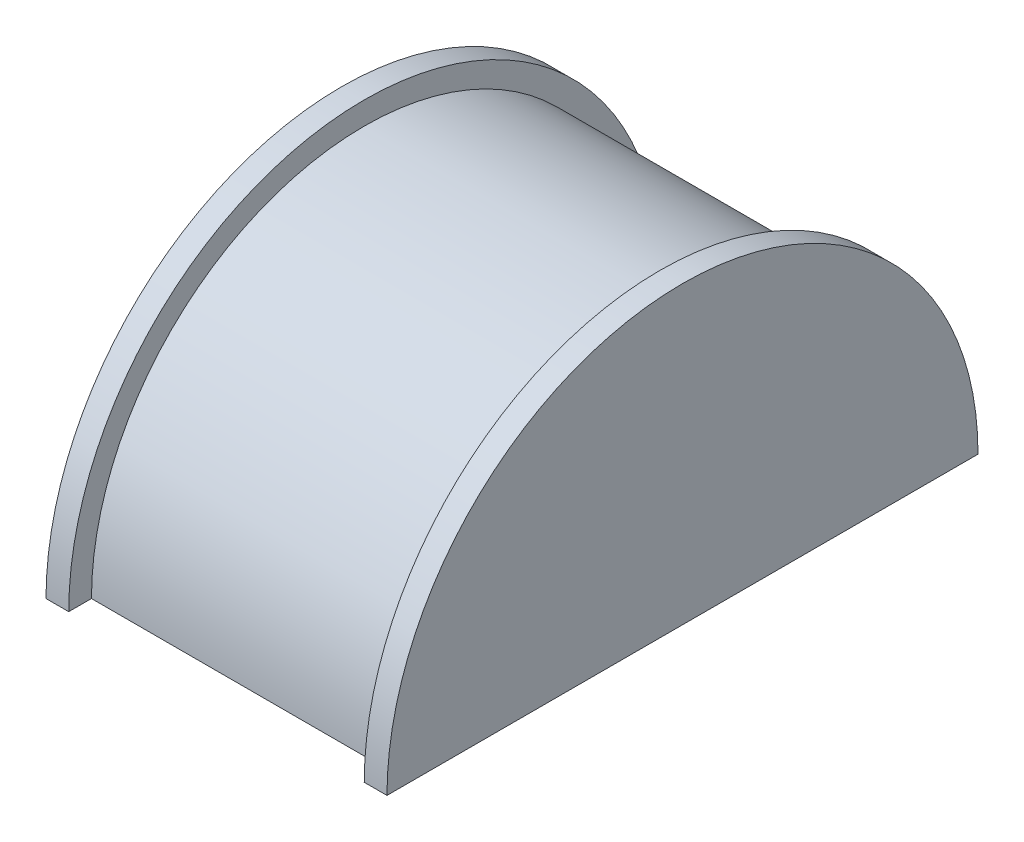
ISO-10303-21;
HEADER;
FILE_DESCRIPTION(('STEP AP214'),'2;1');
FILE_NAME('part.step','',(''),(''),'','','');
FILE_SCHEMA(('AUTOMOTIVE_DESIGN { 1 0 10303 214 1 1 1 1 }'));
ENDSEC;
DATA;
#1=APPLICATION_CONTEXT('core data for automotive mechanical design processes');
#2=APPLICATION_PROTOCOL_DEFINITION('international standard','automotive_design',2000,#1);
#3=PRODUCT_CONTEXT('',#1,'mechanical');
#4=PRODUCT('Part','Part','',(#3));
#5=PRODUCT_RELATED_PRODUCT_CATEGORY('part','',(#4));
#6=PRODUCT_DEFINITION_FORMATION('','',#4);
#7=PRODUCT_DEFINITION_CONTEXT('part definition',#1,'design');
#8=PRODUCT_DEFINITION('design','',#6,#7);
#9=PRODUCT_DEFINITION_SHAPE('','',#8);
#10=(LENGTH_UNIT() NAMED_UNIT(*) SI_UNIT(.MILLI.,.METRE.));
#11=(NAMED_UNIT(*) PLANE_ANGLE_UNIT() SI_UNIT($,.RADIAN.));
#12=(NAMED_UNIT(*) SI_UNIT($,.STERADIAN.) SOLID_ANGLE_UNIT());
#13=UNCERTAINTY_MEASURE_WITH_UNIT(LENGTH_MEASURE(1.E-05),#10,'distance_accuracy_value','');
#14=(GEOMETRIC_REPRESENTATION_CONTEXT(3) GLOBAL_UNCERTAINTY_ASSIGNED_CONTEXT((#13)) GLOBAL_UNIT_ASSIGNED_CONTEXT((#10,
#11,#12)) REPRESENTATION_CONTEXT('',''));
#15=CARTESIAN_POINT('',(0.,0.,0.));
#16=DIRECTION('',(0.,0.,1.));
#17=DIRECTION('',(1.,0.,0.));
#18=AXIS2_PLACEMENT_3D('',#15,#16,#17);
#19=CARTESIAN_POINT('',(6.5,0.,0.));
#20=DIRECTION('',(-1.,0.,0.));
#21=DIRECTION('',(0.,0.,1.));
#22=AXIS2_PLACEMENT_3D('',#19,#20,#21);
#23=CYLINDRICAL_SURFACE('',#22,6.);
#24=CARTESIAN_POINT('',(0.,0.,0.));
#25=DIRECTION('',(1.,0.,0.));
#26=DIRECTION('',(0.,0.,-1.));
#27=AXIS2_PLACEMENT_3D('',#24,#25,#26);
#28=CIRCLE('',#27,6.);
#29=CARTESIAN_POINT('',(0.,0.,-6.));
#30=VERTEX_POINT('',#29);
#31=CARTESIAN_POINT('',(0.,0.,6.));
#32=VERTEX_POINT('',#31);
#33=EDGE_CURVE('E125',#30,#32,#28,.T.);
#34=ORIENTED_EDGE('',*,*,#33,.T.);
#35=DIRECTION('',(-1.,0.,0.));
#36=VECTOR('',#35,1.);
#37=CARTESIAN_POINT('',(6.5,0.,6.));
#38=LINE('',#37,#36);
#39=CARTESIAN_POINT('',(6.5,0.,6.));
#40=VERTEX_POINT('',#39);
#41=EDGE_CURVE('E11',#40,#32,#38,.T.);
#42=ORIENTED_EDGE('',*,*,#41,.F.);
#43=CARTESIAN_POINT('',(6.5,0.,0.));
#44=DIRECTION('',(1.,0.,0.));
#45=DIRECTION('',(0.,0.,-1.));
#46=AXIS2_PLACEMENT_3D('',#43,#44,#45);
#47=CIRCLE('',#46,6.);
#48=CARTESIAN_POINT('',(6.5,0.,-6.));
#49=VERTEX_POINT('',#48);
#50=EDGE_CURVE('E126',#49,#40,#47,.T.);
#51=ORIENTED_EDGE('',*,*,#50,.F.);
#52=DIRECTION('',(-1.,0.,0.));
#53=VECTOR('',#52,1.);
#54=CARTESIAN_POINT('',(6.5,0.,-6.));
#55=LINE('',#54,#53);
#56=EDGE_CURVE('E41',#49,#30,#55,.T.);
#57=ORIENTED_EDGE('',*,*,#56,.T.);
#58=EDGE_LOOP('',(#34,#42,#51,#57));
#59=FACE_BOUND('',#58,.T.);
#60=ADVANCED_FACE('F33',(#59),#23,.T.);
#61=CARTESIAN_POINT('',(6.5,0.,6.));
#62=DIRECTION('',(0.,1.,0.));
#63=DIRECTION('',(0.,0.,1.));
#64=AXIS2_PLACEMENT_3D('',#61,#62,#63);
#65=PLANE('',#64);
#66=CARTESIAN_POINT('',(3.25,0.,0.));
#67=DIRECTION('',(0.,-1.,0.));
#68=DIRECTION('',(0.,0.,-1.));
#69=AXIS2_PLACEMENT_3D('',#66,#67,#68);
#70=CIRCLE('',#69,1.9);
#71=CARTESIAN_POINT('',(3.25,0.,-1.9));
#72=VERTEX_POINT('',#71);
#73=EDGE_CURVE('E210',#72,#72,#70,.T.);
#74=ORIENTED_EDGE('',*,*,#73,.F.);
#75=EDGE_LOOP('',(#74));
#76=FACE_BOUND('',#75,.T.);
#77=ORIENTED_EDGE('',*,*,#41,.T.);
#78=DIRECTION('',(0.,0.,-1.));
#79=VECTOR('',#78,1.);
#80=CARTESIAN_POINT('',(0.,0.,6.5));
#81=LINE('',#80,#79);
#82=CARTESIAN_POINT('',(0.,0.,6.5));
#83=VERTEX_POINT('',#82);
#84=EDGE_CURVE('E96',#83,#32,#81,.T.);
#85=ORIENTED_EDGE('',*,*,#84,.F.);
#86=DIRECTION('',(1.,0.,0.));
#87=VECTOR('',#86,1.);
#88=CARTESIAN_POINT('',(-0.5,0.,6.5));
#89=LINE('',#88,#87);
#90=CARTESIAN_POINT('',(-0.5,0.,6.5));
#91=VERTEX_POINT('',#90);
#92=EDGE_CURVE('E91',#91,#83,#89,.T.);
#93=ORIENTED_EDGE('',*,*,#92,.F.);
#94=DIRECTION('',(0.,0.,-1.));
#95=VECTOR('',#94,1.);
#96=CARTESIAN_POINT('',(-0.5,0.,6.5));
#97=LINE('',#96,#95);
#98=CARTESIAN_POINT('',(-0.5,0.,-6.5));
#99=VERTEX_POINT('',#98);
#100=EDGE_CURVE('E95',#91,#99,#97,.T.);
#101=ORIENTED_EDGE('',*,*,#100,.T.);
#102=DIRECTION('',(1.,0.,0.));
#103=VECTOR('',#102,1.);
#104=CARTESIAN_POINT('',(-0.5,0.,-6.5));
#105=LINE('',#104,#103);
#106=CARTESIAN_POINT('',(0.,0.,-6.5));
#107=VERTEX_POINT('',#106);
#108=EDGE_CURVE('E82',#99,#107,#105,.T.);
#109=ORIENTED_EDGE('',*,*,#108,.T.);
#110=EDGE_CURVE('E105',#30,#107,#81,.T.);
#111=ORIENTED_EDGE('',*,*,#110,.F.);
#112=ORIENTED_EDGE('',*,*,#56,.F.);
#113=DIRECTION('',(0.,0.,-1.));
#114=VECTOR('',#113,1.);
#115=CARTESIAN_POINT('',(6.5,0.,6.5));
#116=LINE('',#115,#114);
#117=CARTESIAN_POINT('',(6.5,0.,-6.5));
#118=VERTEX_POINT('',#117);
#119=EDGE_CURVE('E117',#49,#118,#116,.T.);
#120=ORIENTED_EDGE('',*,*,#119,.T.);
#121=DIRECTION('',(-1.,0.,0.));
#122=VECTOR('',#121,1.);
#123=CARTESIAN_POINT('',(7.,0.,-6.5));
#124=LINE('',#123,#122);
#125=CARTESIAN_POINT('',(7.,0.,-6.5));
#126=VERTEX_POINT('',#125);
#127=EDGE_CURVE('E114',#126,#118,#124,.T.);
#128=ORIENTED_EDGE('',*,*,#127,.F.);
#129=DIRECTION('',(0.,0.,-1.));
#130=VECTOR('',#129,1.);
#131=CARTESIAN_POINT('',(7.,0.,6.5));
#132=LINE('',#131,#130);
#133=CARTESIAN_POINT('',(7.,0.,6.5));
#134=VERTEX_POINT('',#133);
#135=EDGE_CURVE('E111',#134,#126,#132,.T.);
#136=ORIENTED_EDGE('',*,*,#135,.F.);
#137=DIRECTION('',(-1.,0.,0.));
#138=VECTOR('',#137,1.);
#139=CARTESIAN_POINT('',(7.,0.,6.5));
#140=LINE('',#139,#138);
#141=CARTESIAN_POINT('',(6.5,0.,6.5));
#142=VERTEX_POINT('',#141);
#143=EDGE_CURVE('E122',#134,#142,#140,.T.);
#144=ORIENTED_EDGE('',*,*,#143,.T.);
#145=EDGE_CURVE('E112',#142,#40,#116,.T.);
#146=ORIENTED_EDGE('',*,*,#145,.T.);
#147=EDGE_LOOP('',(#77,#85,#93,#101,#109,#111,#112,#120,#128,#136,#144,#146));
#148=FACE_BOUND('',#147,.T.);
#149=ADVANCED_FACE('F98',(#76,#148),#65,.F.);
#150=CARTESIAN_POINT('',(7.,0.,0.));
#151=DIRECTION('',(-1.,0.,0.));
#152=DIRECTION('',(0.,0.,1.));
#153=AXIS2_PLACEMENT_3D('',#150,#151,#152);
#154=CYLINDRICAL_SURFACE('',#153,6.5);
#155=CARTESIAN_POINT('',(6.5,0.,0.));
#156=DIRECTION('',(1.,0.,0.));
#157=DIRECTION('',(0.,0.,-1.));
#158=AXIS2_PLACEMENT_3D('',#155,#156,#157);
#159=CIRCLE('',#158,6.5);
#160=EDGE_CURVE('E90',#118,#142,#159,.T.);
#161=ORIENTED_EDGE('',*,*,#160,.T.);
#162=ORIENTED_EDGE('',*,*,#143,.F.);
#163=CARTESIAN_POINT('',(7.,0.,0.));
#164=DIRECTION('',(1.,0.,0.));
#165=DIRECTION('',(0.,0.,-1.));
#166=AXIS2_PLACEMENT_3D('',#163,#164,#165);
#167=CIRCLE('',#166,6.5);
#168=EDGE_CURVE('E108',#126,#134,#167,.T.);
#169=ORIENTED_EDGE('',*,*,#168,.F.);
#170=ORIENTED_EDGE('',*,*,#127,.T.);
#171=EDGE_LOOP('',(#161,#162,#169,#170));
#172=FACE_BOUND('',#171,.T.);
#173=ADVANCED_FACE('F138',(#172),#154,.T.);
#174=CARTESIAN_POINT('',(7.,0.,0.));
#175=DIRECTION('',(1.,0.,0.));
#176=DIRECTION('',(0.,0.,-1.));
#177=AXIS2_PLACEMENT_3D('',#174,#175,#176);
#178=PLANE('',#177);
#179=ORIENTED_EDGE('',*,*,#168,.T.);
#180=ORIENTED_EDGE('',*,*,#135,.T.);
#181=EDGE_LOOP('',(#179,#180));
#182=FACE_BOUND('',#181,.T.);
#183=ADVANCED_FACE('F141',(#182),#178,.T.);
#184=CARTESIAN_POINT('',(6.5,0.,0.));
#185=DIRECTION('',(1.,0.,0.));
#186=DIRECTION('',(0.,0.,-1.));
#187=AXIS2_PLACEMENT_3D('',#184,#185,#186);
#188=PLANE('',#187);
#189=ORIENTED_EDGE('',*,*,#119,.F.);
#190=ORIENTED_EDGE('',*,*,#50,.T.);
#191=ORIENTED_EDGE('',*,*,#145,.F.);
#192=ORIENTED_EDGE('',*,*,#160,.F.);
#193=EDGE_LOOP('',(#189,#190,#191,#192));
#194=FACE_BOUND('',#193,.T.);
#195=ADVANCED_FACE('F134',(#194),#188,.F.);
#196=CARTESIAN_POINT('',(-0.5,0.,0.));
#197=DIRECTION('',(1.,0.,0.));
#198=DIRECTION('',(0.,0.,-1.));
#199=AXIS2_PLACEMENT_3D('',#196,#197,#198);
#200=CYLINDRICAL_SURFACE('',#199,6.5);
#201=CARTESIAN_POINT('',(0.,0.,0.));
#202=DIRECTION('',(1.,0.,0.));
#203=DIRECTION('',(0.,0.,-1.));
#204=AXIS2_PLACEMENT_3D('',#201,#202,#203);
#205=CIRCLE('',#204,6.5);
#206=EDGE_CURVE('E88',#107,#83,#205,.T.);
#207=ORIENTED_EDGE('',*,*,#206,.F.);
#208=ORIENTED_EDGE('',*,*,#108,.F.);
#209=CARTESIAN_POINT('',(-0.5,0.,0.));
#210=DIRECTION('',(1.,0.,0.));
#211=DIRECTION('',(0.,0.,-1.));
#212=AXIS2_PLACEMENT_3D('',#209,#210,#211);
#213=CIRCLE('',#212,6.5);
#214=EDGE_CURVE('E85',#99,#91,#213,.T.);
#215=ORIENTED_EDGE('',*,*,#214,.T.);
#216=ORIENTED_EDGE('',*,*,#92,.T.);
#217=EDGE_LOOP('',(#207,#208,#215,#216));
#218=FACE_BOUND('',#217,.T.);
#219=ADVANCED_FACE('F84',(#218),#200,.T.);
#220=CARTESIAN_POINT('',(-0.5,0.,0.));
#221=DIRECTION('',(-1.,0.,0.));
#222=DIRECTION('',(0.,0.,-1.));
#223=AXIS2_PLACEMENT_3D('',#220,#221,#222);
#224=PLANE('',#223);
#225=ORIENTED_EDGE('',*,*,#214,.F.);
#226=ORIENTED_EDGE('',*,*,#100,.F.);
#227=EDGE_LOOP('',(#225,#226));
#228=FACE_BOUND('',#227,.T.);
#229=ADVANCED_FACE('F94',(#228),#224,.T.);
#230=CARTESIAN_POINT('',(0.,0.,0.));
#231=DIRECTION('',(-1.,0.,0.));
#232=DIRECTION('',(0.,0.,-1.));
#233=AXIS2_PLACEMENT_3D('',#230,#231,#232);
#234=PLANE('',#233);
#235=ORIENTED_EDGE('',*,*,#33,.F.);
#236=ORIENTED_EDGE('',*,*,#110,.T.);
#237=ORIENTED_EDGE('',*,*,#206,.T.);
#238=ORIENTED_EDGE('',*,*,#84,.T.);
#239=EDGE_LOOP('',(#235,#236,#237,#238));
#240=FACE_BOUND('',#239,.T.);
#241=ADVANCED_FACE('F143',(#240),#234,.F.);
#242=CARTESIAN_POINT('',(3.25,5.,0.));
#243=DIRECTION('',(0.,-1.,0.));
#244=DIRECTION('',(0.,0.,-1.));
#245=AXIS2_PLACEMENT_3D('',#242,#243,#244);
#246=CYLINDRICAL_SURFACE('',#245,1.9);
#247=CARTESIAN_POINT('',(3.25,5.,0.));
#248=DIRECTION('',(0.,-1.,0.));
#249=DIRECTION('',(0.,0.,-1.));
#250=AXIS2_PLACEMENT_3D('',#247,#248,#249);
#251=CIRCLE('',#250,1.9);
#252=CARTESIAN_POINT('',(3.25,5.,-1.9));
#253=VERTEX_POINT('',#252);
#254=EDGE_CURVE('E106',#253,#253,#251,.T.);
#255=ORIENTED_EDGE('',*,*,#254,.F.);
#256=EDGE_LOOP('',(#255));
#257=FACE_BOUND('',#256,.T.);
#258=ORIENTED_EDGE('',*,*,#73,.T.);
#259=EDGE_LOOP('',(#258));
#260=FACE_BOUND('',#259,.T.);
#261=ADVANCED_FACE('F145',(#257,#260),#246,.F.);
#262=CARTESIAN_POINT('',(3.25,5.,0.));
#263=DIRECTION('',(0.,-1.,0.));
#264=DIRECTION('',(0.,0.,-1.));
#265=AXIS2_PLACEMENT_3D('',#262,#263,#264);
#266=PLANE('',#265);
#267=ORIENTED_EDGE('',*,*,#254,.T.);
#268=EDGE_LOOP('',(#267));
#269=FACE_BOUND('',#268,.T.);
#270=ADVANCED_FACE('F151',(#269),#266,.T.);
#271=CLOSED_SHELL('',(#60,#149,#173,#183,#195,#219,#229,#241,#261,#270));
#272=MANIFOLD_SOLID_BREP('B2',#271);
#273=ADVANCED_BREP_SHAPE_REPRESENTATION('',(#18,#272),#14);
#274=SHAPE_DEFINITION_REPRESENTATION(#9,#273);
ENDSEC;
END-ISO-10303-21;
